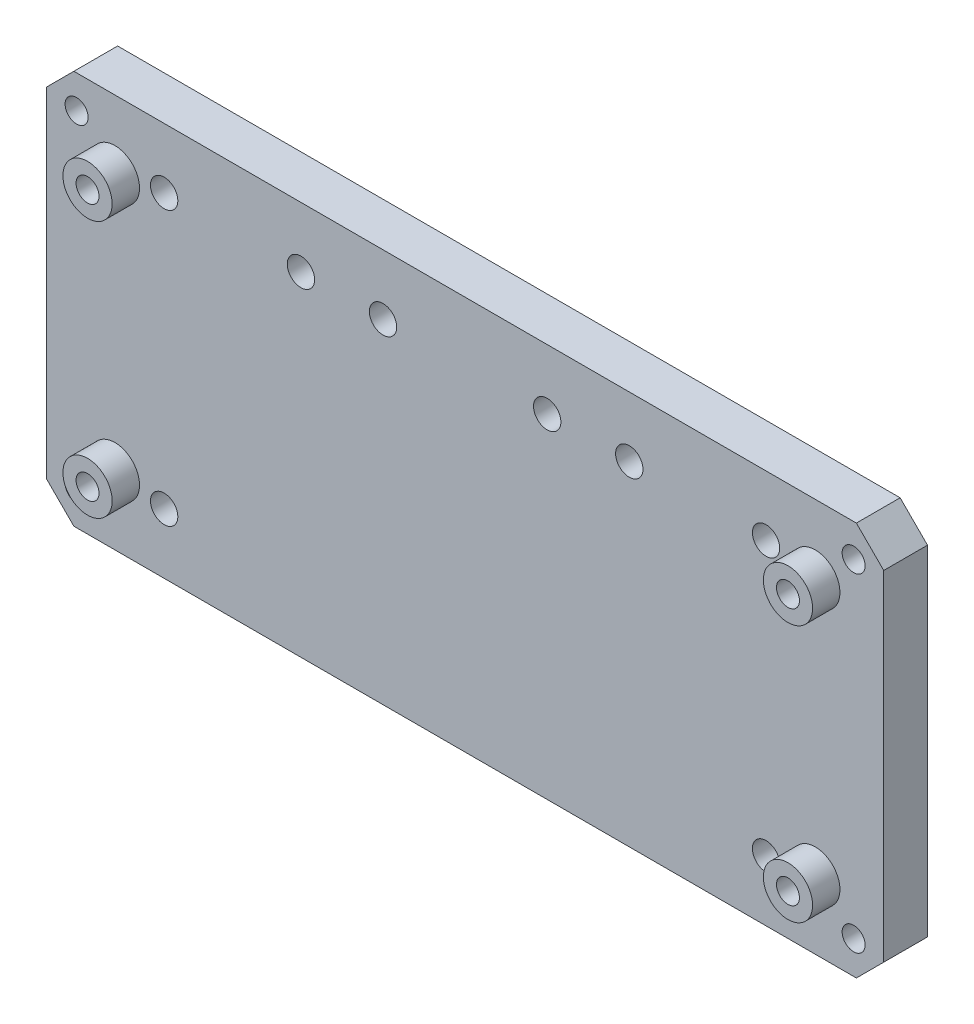
ISO-10303-21;
HEADER;
FILE_DESCRIPTION(('STEP AP214'),'2;1');
FILE_NAME('part.step','',(''),(''),'','','');
FILE_SCHEMA(('AUTOMOTIVE_DESIGN { 1 0 10303 214 1 1 1 1 }'));
ENDSEC;
DATA;
#1=APPLICATION_CONTEXT('core data for automotive mechanical design processes');
#2=APPLICATION_PROTOCOL_DEFINITION('international standard','automotive_design',2000,#1);
#3=PRODUCT_CONTEXT('',#1,'mechanical');
#4=PRODUCT('Part','Part','',(#3));
#5=PRODUCT_RELATED_PRODUCT_CATEGORY('part','',(#4));
#6=PRODUCT_DEFINITION_FORMATION('','',#4);
#7=PRODUCT_DEFINITION_CONTEXT('part definition',#1,'design');
#8=PRODUCT_DEFINITION('design','',#6,#7);
#9=PRODUCT_DEFINITION_SHAPE('','',#8);
#10=(LENGTH_UNIT() NAMED_UNIT(*) SI_UNIT(.MILLI.,.METRE.));
#11=(NAMED_UNIT(*) PLANE_ANGLE_UNIT() SI_UNIT($,.RADIAN.));
#12=(NAMED_UNIT(*) SI_UNIT($,.STERADIAN.) SOLID_ANGLE_UNIT());
#13=UNCERTAINTY_MEASURE_WITH_UNIT(LENGTH_MEASURE(1.E-05),#10,'distance_accuracy_value','');
#14=(GEOMETRIC_REPRESENTATION_CONTEXT(3) GLOBAL_UNCERTAINTY_ASSIGNED_CONTEXT((#13)) GLOBAL_UNIT_ASSIGNED_CONTEXT((#10,
#11,#12)) REPRESENTATION_CONTEXT('',''));
#15=CARTESIAN_POINT('',(0.,0.,0.));
#16=DIRECTION('',(0.,0.,1.));
#17=DIRECTION('',(1.,0.,0.));
#18=AXIS2_PLACEMENT_3D('',#15,#16,#17);
#19=CARTESIAN_POINT('',(0.,0.,8.));
#20=DIRECTION('',(0.,0.,-1.));
#21=DIRECTION('',(-1.,0.,0.));
#22=AXIS2_PLACEMENT_3D('',#19,#20,#21);
#23=PLANE('',#22);
#24=CARTESIAN_POINT('',(5.49999999999999,66.,8.));
#25=DIRECTION('',(0.,0.,1.));
#26=DIRECTION('',(-1.,0.,0.));
#27=AXIS2_PLACEMENT_3D('',#24,#25,#26);
#28=CIRCLE('',#27,2.1);
#29=CARTESIAN_POINT('',(3.39999999999999,66.,8.));
#30=VERTEX_POINT('',#29);
#31=EDGE_CURVE('E287',#30,#30,#28,.T.);
#32=ORIENTED_EDGE('',*,*,#31,.F.);
#33=EDGE_LOOP('',(#32));
#34=FACE_BOUND('',#33,.T.);
#35=CARTESIAN_POINT('',(147.5,6.00000000000003,8.));
#36=DIRECTION('',(0.,0.,1.));
#37=DIRECTION('',(-1.,0.,0.));
#38=AXIS2_PLACEMENT_3D('',#35,#36,#37);
#39=CIRCLE('',#38,2.10000000000002);
#40=CARTESIAN_POINT('',(145.4,6.00000000000003,8.));
#41=VERTEX_POINT('',#40);
#42=EDGE_CURVE('E280',#41,#41,#39,.T.);
#43=ORIENTED_EDGE('',*,*,#42,.F.);
#44=EDGE_LOOP('',(#43));
#45=FACE_BOUND('',#44,.T.);
#46=CARTESIAN_POINT('',(147.5,66.,8.));
#47=DIRECTION('',(0.,0.,1.));
#48=DIRECTION('',(1.,0.,0.));
#49=AXIS2_PLACEMENT_3D('',#46,#47,#48);
#50=CIRCLE('',#49,2.10000000000002);
#51=CARTESIAN_POINT('',(149.6,66.,8.));
#52=VERTEX_POINT('',#51);
#53=EDGE_CURVE('E292',#52,#52,#50,.T.);
#54=ORIENTED_EDGE('',*,*,#53,.F.);
#55=EDGE_LOOP('',(#54));
#56=FACE_BOUND('',#55,.T.);
#57=CARTESIAN_POINT('',(5.49999999999999,6.,8.));
#58=DIRECTION('',(0.,0.,1.));
#59=DIRECTION('',(1.,0.,0.));
#60=AXIS2_PLACEMENT_3D('',#57,#58,#59);
#61=CIRCLE('',#60,2.1);
#62=CARTESIAN_POINT('',(7.6,6.,8.));
#63=VERTEX_POINT('',#62);
#64=EDGE_CURVE('E274',#63,#63,#61,.T.);
#65=ORIENTED_EDGE('',*,*,#64,.F.);
#66=EDGE_LOOP('',(#65));
#67=FACE_BOUND('',#66,.T.);
#68=CARTESIAN_POINT('',(140.5,12.5,8.));
#69=DIRECTION('',(0.,0.,-1.));
#70=DIRECTION('',(-1.,0.,0.));
#71=AXIS2_PLACEMENT_3D('',#68,#69,#70);
#72=CIRCLE('',#71,4.50000000000002);
#73=CARTESIAN_POINT('',(136.,12.5,8.));
#74=VERTEX_POINT('',#73);
#75=EDGE_CURVE('E149',#74,#74,#72,.F.);
#76=ORIENTED_EDGE('',*,*,#75,.F.);
#77=EDGE_LOOP('',(#76));
#78=FACE_BOUND('',#77,.T.);
#79=CARTESIAN_POINT('',(140.5,59.5,8.));
#80=DIRECTION('',(0.,0.,-1.));
#81=DIRECTION('',(-1.,0.,0.));
#82=AXIS2_PLACEMENT_3D('',#79,#80,#81);
#83=CIRCLE('',#82,4.50000000000002);
#84=CARTESIAN_POINT('',(136.,59.5,8.));
#85=VERTEX_POINT('',#84);
#86=EDGE_CURVE('E146',#85,#85,#83,.F.);
#87=ORIENTED_EDGE('',*,*,#86,.F.);
#88=EDGE_LOOP('',(#87));
#89=FACE_BOUND('',#88,.T.);
#90=CARTESIAN_POINT('',(12.5,12.5,8.));
#91=DIRECTION('',(0.,0.,-1.));
#92=DIRECTION('',(-1.,0.,0.));
#93=AXIS2_PLACEMENT_3D('',#90,#91,#92);
#94=CIRCLE('',#93,4.50000000000001);
#95=CARTESIAN_POINT('',(7.99999999999999,12.5,8.));
#96=VERTEX_POINT('',#95);
#97=EDGE_CURVE('E143',#96,#96,#94,.F.);
#98=ORIENTED_EDGE('',*,*,#97,.F.);
#99=EDGE_LOOP('',(#98));
#100=FACE_BOUND('',#99,.T.);
#101=CARTESIAN_POINT('',(12.5,59.5,8.));
#102=DIRECTION('',(0.,0.,-1.));
#103=DIRECTION('',(-1.,0.,0.));
#104=AXIS2_PLACEMENT_3D('',#101,#102,#103);
#105=CIRCLE('',#104,4.50000000000001);
#106=CARTESIAN_POINT('',(7.99999999999999,59.5,8.));
#107=VERTEX_POINT('',#106);
#108=EDGE_CURVE('E140',#107,#107,#105,.F.);
#109=ORIENTED_EDGE('',*,*,#108,.F.);
#110=EDGE_LOOP('',(#109));
#111=FACE_BOUND('',#110,.T.);
#112=DIRECTION('',(0.,1.,0.));
#113=VECTOR('',#112,1.);
#114=CARTESIAN_POINT('',(153.,0.,8.));
#115=LINE('',#114,#113);
#116=CARTESIAN_POINT('',(153.,4.99999999999996,8.));
#117=VERTEX_POINT('',#116);
#118=CARTESIAN_POINT('',(153.,66.9999999999999,8.));
#119=VERTEX_POINT('',#118);
#120=EDGE_CURVE('E187',#117,#119,#115,.T.);
#121=ORIENTED_EDGE('',*,*,#120,.T.);
#122=DIRECTION('',(0.707106781186546,-0.707106781186549,0.));
#123=VECTOR('',#122,1.);
#124=CARTESIAN_POINT('',(148.,72.,8.));
#125=LINE('',#124,#123);
#126=CARTESIAN_POINT('',(148.,72.,8.));
#127=VERTEX_POINT('',#126);
#128=EDGE_CURVE('E164',#119,#127,#125,.F.);
#129=ORIENTED_EDGE('',*,*,#128,.T.);
#130=DIRECTION('',(-1.,0.,0.));
#131=VECTOR('',#130,1.);
#132=CARTESIAN_POINT('',(0.,72.,8.));
#133=LINE('',#132,#131);
#134=CARTESIAN_POINT('',(5.,72.,8.));
#135=VERTEX_POINT('',#134);
#136=EDGE_CURVE('E123',#127,#135,#133,.T.);
#137=ORIENTED_EDGE('',*,*,#136,.T.);
#138=DIRECTION('',(0.707106781186549,0.707106781186547,0.));
#139=VECTOR('',#138,1.);
#140=CARTESIAN_POINT('',(0.,67.,8.));
#141=LINE('',#140,#139);
#142=CARTESIAN_POINT('',(0.,67.,8.));
#143=VERTEX_POINT('',#142);
#144=EDGE_CURVE('E160',#135,#143,#141,.F.);
#145=ORIENTED_EDGE('',*,*,#144,.T.);
#146=DIRECTION('',(0.,-1.,0.));
#147=VECTOR('',#146,1.);
#148=CARTESIAN_POINT('',(0.,0.,8.));
#149=LINE('',#148,#147);
#150=CARTESIAN_POINT('',(0.,4.99999999999999,8.));
#151=VERTEX_POINT('',#150);
#152=EDGE_CURVE('E131',#143,#151,#149,.T.);
#153=ORIENTED_EDGE('',*,*,#152,.T.);
#154=DIRECTION('',(-0.707106781186546,0.707106781186549,0.));
#155=VECTOR('',#154,1.);
#156=CARTESIAN_POINT('',(4.99999999999996,0.,8.));
#157=LINE('',#156,#155);
#158=CARTESIAN_POINT('',(4.99999999999996,0.,8.));
#159=VERTEX_POINT('',#158);
#160=EDGE_CURVE('E58',#151,#159,#157,.F.);
#161=ORIENTED_EDGE('',*,*,#160,.T.);
#162=DIRECTION('',(1.,0.,0.));
#163=VECTOR('',#162,1.);
#164=CARTESIAN_POINT('',(0.,0.,8.));
#165=LINE('',#164,#163);
#166=CARTESIAN_POINT('',(148.,0.,8.));
#167=VERTEX_POINT('',#166);
#168=EDGE_CURVE('E134',#159,#167,#165,.T.);
#169=ORIENTED_EDGE('',*,*,#168,.T.);
#170=DIRECTION('',(-0.707106781186549,-0.707106781186547,0.));
#171=VECTOR('',#170,1.);
#172=CARTESIAN_POINT('',(153.,4.99999999999996,8.));
#173=LINE('',#172,#171);
#174=EDGE_CURVE('E162',#167,#117,#173,.F.);
#175=ORIENTED_EDGE('',*,*,#174,.T.);
#176=EDGE_LOOP('',(#121,#129,#137,#145,#153,#161,#169,#175));
#177=FACE_BOUND('',#176,.T.);
#178=CARTESIAN_POINT('',(21.5,61.,8.));
#179=DIRECTION('',(0.,0.,1.));
#180=DIRECTION('',(1.,0.,0.));
#181=AXIS2_PLACEMENT_3D('',#178,#179,#180);
#182=CIRCLE('',#181,2.5);
#183=CARTESIAN_POINT('',(24.,61.,8.));
#184=VERTEX_POINT('',#183);
#185=EDGE_CURVE('E183',#184,#184,#182,.T.);
#186=ORIENTED_EDGE('',*,*,#185,.F.);
#187=EDGE_LOOP('',(#186));
#188=FACE_BOUND('',#187,.T.);
#189=CARTESIAN_POINT('',(21.5,11.,8.));
#190=DIRECTION('',(0.,0.,1.));
#191=DIRECTION('',(-1.,0.,0.));
#192=AXIS2_PLACEMENT_3D('',#189,#190,#191);
#193=CIRCLE('',#192,2.5);
#194=CARTESIAN_POINT('',(19.,11.,8.));
#195=VERTEX_POINT('',#194);
#196=EDGE_CURVE('E193',#195,#195,#193,.T.);
#197=ORIENTED_EDGE('',*,*,#196,.F.);
#198=EDGE_LOOP('',(#197));
#199=FACE_BOUND('',#198,.T.);
#200=CARTESIAN_POINT('',(131.5,61.,8.));
#201=DIRECTION('',(0.,0.,1.));
#202=DIRECTION('',(-1.,0.,0.));
#203=AXIS2_PLACEMENT_3D('',#200,#201,#202);
#204=CIRCLE('',#203,2.5);
#205=CARTESIAN_POINT('',(129.,61.,8.));
#206=VERTEX_POINT('',#205);
#207=EDGE_CURVE('E199',#206,#206,#204,.T.);
#208=ORIENTED_EDGE('',*,*,#207,.F.);
#209=EDGE_LOOP('',(#208));
#210=FACE_BOUND('',#209,.T.);
#211=CARTESIAN_POINT('',(131.5,11.,8.));
#212=DIRECTION('',(0.,0.,1.));
#213=DIRECTION('',(1.,0.,0.));
#214=AXIS2_PLACEMENT_3D('',#211,#212,#213);
#215=CIRCLE('',#214,2.5);
#216=CARTESIAN_POINT('',(134.,11.,8.));
#217=VERTEX_POINT('',#216);
#218=EDGE_CURVE('E205',#217,#217,#215,.T.);
#219=ORIENTED_EDGE('',*,*,#218,.F.);
#220=EDGE_LOOP('',(#219));
#221=FACE_BOUND('',#220,.T.);
#222=CARTESIAN_POINT('',(61.5,61.,8.));
#223=DIRECTION('',(0.,0.,1.));
#224=DIRECTION('',(1.,0.,0.));
#225=AXIS2_PLACEMENT_3D('',#222,#223,#224);
#226=CIRCLE('',#225,2.5);
#227=CARTESIAN_POINT('',(64.,61.,8.));
#228=VERTEX_POINT('',#227);
#229=EDGE_CURVE('E211',#228,#228,#226,.T.);
#230=ORIENTED_EDGE('',*,*,#229,.F.);
#231=EDGE_LOOP('',(#230));
#232=FACE_BOUND('',#231,.T.);
#233=CARTESIAN_POINT('',(46.5,61.,8.));
#234=DIRECTION('',(0.,0.,1.));
#235=DIRECTION('',(1.,0.,0.));
#236=AXIS2_PLACEMENT_3D('',#233,#234,#235);
#237=CIRCLE('',#236,2.5);
#238=CARTESIAN_POINT('',(49.,61.,8.));
#239=VERTEX_POINT('',#238);
#240=EDGE_CURVE('E217',#239,#239,#237,.T.);
#241=ORIENTED_EDGE('',*,*,#240,.F.);
#242=EDGE_LOOP('',(#241));
#243=FACE_BOUND('',#242,.T.);
#244=CARTESIAN_POINT('',(106.5,61.,8.));
#245=DIRECTION('',(0.,0.,1.));
#246=DIRECTION('',(-1.,0.,0.));
#247=AXIS2_PLACEMENT_3D('',#244,#245,#246);
#248=CIRCLE('',#247,2.50000000000001);
#249=CARTESIAN_POINT('',(104.,61.,8.));
#250=VERTEX_POINT('',#249);
#251=EDGE_CURVE('E223',#250,#250,#248,.T.);
#252=ORIENTED_EDGE('',*,*,#251,.F.);
#253=EDGE_LOOP('',(#252));
#254=FACE_BOUND('',#253,.T.);
#255=CARTESIAN_POINT('',(91.5,61.,8.));
#256=DIRECTION('',(0.,0.,1.));
#257=DIRECTION('',(-1.,0.,0.));
#258=AXIS2_PLACEMENT_3D('',#255,#256,#257);
#259=CIRCLE('',#258,2.5);
#260=CARTESIAN_POINT('',(89.,61.,8.));
#261=VERTEX_POINT('',#260);
#262=EDGE_CURVE('E229',#261,#261,#259,.T.);
#263=ORIENTED_EDGE('',*,*,#262,.F.);
#264=EDGE_LOOP('',(#263));
#265=FACE_BOUND('',#264,.T.);
#266=ADVANCED_FACE('F35',(#34,#45,#56,#67,#78,#89,#100,#111,#177,#188,#199,#210,#221,#232,#243,
#254,#265),#23,.F.);
#267=CARTESIAN_POINT('',(0.,0.,0.));
#268=DIRECTION('',(0.,0.,-1.));
#269=DIRECTION('',(-1.,0.,0.));
#270=AXIS2_PLACEMENT_3D('',#267,#268,#269);
#271=PLANE('',#270);
#272=CARTESIAN_POINT('',(106.5,61.,0.));
#273=DIRECTION('',(0.,0.,1.));
#274=DIRECTION('',(-1.,0.,0.));
#275=AXIS2_PLACEMENT_3D('',#272,#273,#274);
#276=CIRCLE('',#275,2.50000000000001);
#277=CARTESIAN_POINT('',(104.,61.,0.));
#278=VERTEX_POINT('',#277);
#279=EDGE_CURVE('E226',#278,#278,#276,.T.);
#280=ORIENTED_EDGE('',*,*,#279,.T.);
#281=EDGE_LOOP('',(#280));
#282=FACE_BOUND('',#281,.T.);
#283=CARTESIAN_POINT('',(61.5,61.,0.));
#284=DIRECTION('',(0.,0.,1.));
#285=DIRECTION('',(1.,0.,0.));
#286=AXIS2_PLACEMENT_3D('',#283,#284,#285);
#287=CIRCLE('',#286,2.5);
#288=CARTESIAN_POINT('',(64.,61.,0.));
#289=VERTEX_POINT('',#288);
#290=EDGE_CURVE('E214',#289,#289,#287,.T.);
#291=ORIENTED_EDGE('',*,*,#290,.T.);
#292=EDGE_LOOP('',(#291));
#293=FACE_BOUND('',#292,.T.);
#294=CARTESIAN_POINT('',(131.5,61.,0.));
#295=DIRECTION('',(0.,0.,1.));
#296=DIRECTION('',(-1.,0.,0.));
#297=AXIS2_PLACEMENT_3D('',#294,#295,#296);
#298=CIRCLE('',#297,2.5);
#299=CARTESIAN_POINT('',(129.,61.,0.));
#300=VERTEX_POINT('',#299);
#301=EDGE_CURVE('E202',#300,#300,#298,.T.);
#302=ORIENTED_EDGE('',*,*,#301,.T.);
#303=EDGE_LOOP('',(#302));
#304=FACE_BOUND('',#303,.T.);
#305=CARTESIAN_POINT('',(21.5,61.,0.));
#306=DIRECTION('',(0.,0.,1.));
#307=DIRECTION('',(1.,0.,0.));
#308=AXIS2_PLACEMENT_3D('',#305,#306,#307);
#309=CIRCLE('',#308,2.5);
#310=CARTESIAN_POINT('',(24.,61.,0.));
#311=VERTEX_POINT('',#310);
#312=EDGE_CURVE('E190',#311,#311,#309,.T.);
#313=ORIENTED_EDGE('',*,*,#312,.T.);
#314=EDGE_LOOP('',(#313));
#315=FACE_BOUND('',#314,.T.);
#316=DIRECTION('',(-1.,0.,0.));
#317=VECTOR('',#316,1.);
#318=CARTESIAN_POINT('',(0.,72.,0.));
#319=LINE('',#318,#317);
#320=CARTESIAN_POINT('',(148.,72.,0.));
#321=VERTEX_POINT('',#320);
#322=CARTESIAN_POINT('',(5.,72.,0.));
#323=VERTEX_POINT('',#322);
#324=EDGE_CURVE('E120',#321,#323,#319,.T.);
#325=ORIENTED_EDGE('',*,*,#324,.F.);
#326=DIRECTION('',(-0.707106781186546,0.707106781186549,0.));
#327=VECTOR('',#326,1.);
#328=CARTESIAN_POINT('',(110.,110.,0.));
#329=LINE('',#328,#327);
#330=CARTESIAN_POINT('',(153.,66.9999999999999,0.));
#331=VERTEX_POINT('',#330);
#332=EDGE_CURVE('E103',#321,#331,#329,.F.);
#333=ORIENTED_EDGE('',*,*,#332,.T.);
#334=DIRECTION('',(0.,1.,0.));
#335=VECTOR('',#334,1.);
#336=CARTESIAN_POINT('',(153.,0.,0.));
#337=LINE('',#336,#335);
#338=CARTESIAN_POINT('',(153.,4.99999999999996,0.));
#339=VERTEX_POINT('',#338);
#340=EDGE_CURVE('E132',#339,#331,#337,.T.);
#341=ORIENTED_EDGE('',*,*,#340,.F.);
#342=DIRECTION('',(0.707106781186549,0.707106781186547,0.));
#343=VECTOR('',#342,1.);
#344=CARTESIAN_POINT('',(73.9999999999998,-74.,0.));
#345=LINE('',#344,#343);
#346=CARTESIAN_POINT('',(148.,0.,0.));
#347=VERTEX_POINT('',#346);
#348=EDGE_CURVE('E114',#339,#347,#345,.F.);
#349=ORIENTED_EDGE('',*,*,#348,.T.);
#350=DIRECTION('',(1.,0.,0.));
#351=VECTOR('',#350,1.);
#352=CARTESIAN_POINT('',(0.,0.,0.));
#353=LINE('',#352,#351);
#354=CARTESIAN_POINT('',(4.99999999999996,0.,0.));
#355=VERTEX_POINT('',#354);
#356=EDGE_CURVE('E136',#355,#347,#353,.T.);
#357=ORIENTED_EDGE('',*,*,#356,.F.);
#358=DIRECTION('',(0.707106781186546,-0.707106781186549,0.));
#359=VECTOR('',#358,1.);
#360=CARTESIAN_POINT('',(2.5,2.49999999999998,0.));
#361=LINE('',#360,#359);
#362=CARTESIAN_POINT('',(0.,4.99999999999999,0.));
#363=VERTEX_POINT('',#362);
#364=EDGE_CURVE('E124',#355,#363,#361,.F.);
#365=ORIENTED_EDGE('',*,*,#364,.T.);
#366=DIRECTION('',(0.,-1.,0.));
#367=VECTOR('',#366,1.);
#368=CARTESIAN_POINT('',(0.,0.,0.));
#369=LINE('',#368,#367);
#370=CARTESIAN_POINT('',(0.,67.,0.));
#371=VERTEX_POINT('',#370);
#372=EDGE_CURVE('E175',#371,#363,#369,.T.);
#373=ORIENTED_EDGE('',*,*,#372,.F.);
#374=DIRECTION('',(-0.707106781186549,-0.707106781186547,0.));
#375=VECTOR('',#374,1.);
#376=CARTESIAN_POINT('',(-33.5,33.5000000000001,0.));
#377=LINE('',#376,#375);
#378=EDGE_CURVE('E130',#371,#323,#377,.F.);
#379=ORIENTED_EDGE('',*,*,#378,.T.);
#380=EDGE_LOOP('',(#325,#333,#341,#349,#357,#365,#373,#379));
#381=FACE_BOUND('',#380,.T.);
#382=CARTESIAN_POINT('',(21.5,11.,0.));
#383=DIRECTION('',(0.,0.,1.));
#384=DIRECTION('',(-1.,0.,0.));
#385=AXIS2_PLACEMENT_3D('',#382,#383,#384);
#386=CIRCLE('',#385,2.5);
#387=CARTESIAN_POINT('',(19.,11.,0.));
#388=VERTEX_POINT('',#387);
#389=EDGE_CURVE('E196',#388,#388,#386,.T.);
#390=ORIENTED_EDGE('',*,*,#389,.T.);
#391=EDGE_LOOP('',(#390));
#392=FACE_BOUND('',#391,.T.);
#393=CARTESIAN_POINT('',(131.5,11.,0.));
#394=DIRECTION('',(0.,0.,1.));
#395=DIRECTION('',(1.,0.,0.));
#396=AXIS2_PLACEMENT_3D('',#393,#394,#395);
#397=CIRCLE('',#396,2.5);
#398=CARTESIAN_POINT('',(134.,11.,0.));
#399=VERTEX_POINT('',#398);
#400=EDGE_CURVE('E208',#399,#399,#397,.T.);
#401=ORIENTED_EDGE('',*,*,#400,.T.);
#402=EDGE_LOOP('',(#401));
#403=FACE_BOUND('',#402,.T.);
#404=CARTESIAN_POINT('',(46.5,61.,0.));
#405=DIRECTION('',(0.,0.,1.));
#406=DIRECTION('',(1.,0.,0.));
#407=AXIS2_PLACEMENT_3D('',#404,#405,#406);
#408=CIRCLE('',#407,2.5);
#409=CARTESIAN_POINT('',(49.,61.,0.));
#410=VERTEX_POINT('',#409);
#411=EDGE_CURVE('E220',#410,#410,#408,.T.);
#412=ORIENTED_EDGE('',*,*,#411,.T.);
#413=EDGE_LOOP('',(#412));
#414=FACE_BOUND('',#413,.T.);
#415=CARTESIAN_POINT('',(91.5,61.,0.));
#416=DIRECTION('',(0.,0.,1.));
#417=DIRECTION('',(-1.,0.,0.));
#418=AXIS2_PLACEMENT_3D('',#415,#416,#417);
#419=CIRCLE('',#418,2.5);
#420=CARTESIAN_POINT('',(89.,61.,0.));
#421=VERTEX_POINT('',#420);
#422=EDGE_CURVE('E232',#421,#421,#419,.T.);
#423=ORIENTED_EDGE('',*,*,#422,.T.);
#424=EDGE_LOOP('',(#423));
#425=FACE_BOUND('',#424,.T.);
#426=ADVANCED_FACE('F127',(#282,#293,#304,#315,#381,#392,#403,#414,#425),#271,.T.);
#427=CARTESIAN_POINT('',(0.,0.,8.));
#428=DIRECTION('',(1.,0.,0.));
#429=DIRECTION('',(0.,0.,-1.));
#430=AXIS2_PLACEMENT_3D('',#427,#428,#429);
#431=PLANE('',#430);
#432=ORIENTED_EDGE('',*,*,#152,.F.);
#433=DIRECTION('',(0.,0.,-1.));
#434=VECTOR('',#433,1.);
#435=CARTESIAN_POINT('',(0.,67.,8.));
#436=LINE('',#435,#434);
#437=EDGE_CURVE('E11',#143,#371,#436,.T.);
#438=ORIENTED_EDGE('',*,*,#437,.T.);
#439=ORIENTED_EDGE('',*,*,#372,.T.);
#440=DIRECTION('',(0.,0.,1.));
#441=VECTOR('',#440,1.);
#442=CARTESIAN_POINT('',(0.,4.99999999999999,8.));
#443=LINE('',#442,#441);
#444=EDGE_CURVE('E44',#363,#151,#443,.T.);
#445=ORIENTED_EDGE('',*,*,#444,.T.);
#446=EDGE_LOOP('',(#432,#438,#439,#445));
#447=FACE_BOUND('',#446,.T.);
#448=ADVANCED_FACE('F173',(#447),#431,.F.);
#449=CARTESIAN_POINT('',(0.,0.,8.));
#450=DIRECTION('',(0.,1.,0.));
#451=DIRECTION('',(0.,0.,1.));
#452=AXIS2_PLACEMENT_3D('',#449,#450,#451);
#453=PLANE('',#452);
#454=ORIENTED_EDGE('',*,*,#356,.T.);
#455=DIRECTION('',(0.,0.,1.));
#456=VECTOR('',#455,1.);
#457=CARTESIAN_POINT('',(148.,0.,8.));
#458=LINE('',#457,#456);
#459=EDGE_CURVE('E51',#347,#167,#458,.T.);
#460=ORIENTED_EDGE('',*,*,#459,.T.);
#461=ORIENTED_EDGE('',*,*,#168,.F.);
#462=DIRECTION('',(0.,0.,-1.));
#463=VECTOR('',#462,1.);
#464=CARTESIAN_POINT('',(4.99999999999996,0.,8.));
#465=LINE('',#464,#463);
#466=EDGE_CURVE('E166',#159,#355,#465,.T.);
#467=ORIENTED_EDGE('',*,*,#466,.T.);
#468=EDGE_LOOP('',(#454,#460,#461,#467));
#469=FACE_BOUND('',#468,.T.);
#470=ADVANCED_FACE('F182',(#469),#453,.F.);
#471=CARTESIAN_POINT('',(153.,0.,8.));
#472=DIRECTION('',(-1.,0.,0.));
#473=DIRECTION('',(0.,0.,1.));
#474=AXIS2_PLACEMENT_3D('',#471,#472,#473);
#475=PLANE('',#474);
#476=ORIENTED_EDGE('',*,*,#340,.T.);
#477=DIRECTION('',(0.,0.,1.));
#478=VECTOR('',#477,1.);
#479=CARTESIAN_POINT('',(153.,66.9999999999999,8.));
#480=LINE('',#479,#478);
#481=EDGE_CURVE('E108',#331,#119,#480,.T.);
#482=ORIENTED_EDGE('',*,*,#481,.T.);
#483=ORIENTED_EDGE('',*,*,#120,.F.);
#484=DIRECTION('',(0.,0.,-1.));
#485=VECTOR('',#484,1.);
#486=CARTESIAN_POINT('',(153.,4.99999999999996,8.));
#487=LINE('',#486,#485);
#488=EDGE_CURVE('E113',#117,#339,#487,.T.);
#489=ORIENTED_EDGE('',*,*,#488,.T.);
#490=EDGE_LOOP('',(#476,#482,#483,#489));
#491=FACE_BOUND('',#490,.T.);
#492=ADVANCED_FACE('F376',(#491),#475,.F.);
#493=CARTESIAN_POINT('',(0.,72.,8.));
#494=DIRECTION('',(0.,-1.,0.));
#495=DIRECTION('',(0.,0.,-1.));
#496=AXIS2_PLACEMENT_3D('',#493,#494,#495);
#497=PLANE('',#496);
#498=ORIENTED_EDGE('',*,*,#136,.F.);
#499=DIRECTION('',(0.,0.,-1.));
#500=VECTOR('',#499,1.);
#501=CARTESIAN_POINT('',(148.,72.,8.));
#502=LINE('',#501,#500);
#503=EDGE_CURVE('E107',#127,#321,#502,.T.);
#504=ORIENTED_EDGE('',*,*,#503,.T.);
#505=ORIENTED_EDGE('',*,*,#324,.T.);
#506=DIRECTION('',(0.,0.,1.));
#507=VECTOR('',#506,1.);
#508=CARTESIAN_POINT('',(5.,72.,8.));
#509=LINE('',#508,#507);
#510=EDGE_CURVE('E125',#323,#135,#509,.T.);
#511=ORIENTED_EDGE('',*,*,#510,.T.);
#512=EDGE_LOOP('',(#498,#504,#505,#511));
#513=FACE_BOUND('',#512,.T.);
#514=ADVANCED_FACE('F119',(#513),#497,.F.);
#515=CARTESIAN_POINT('',(21.5,61.,8.));
#516=DIRECTION('',(0.,0.,-1.));
#517=DIRECTION('',(-1.,0.,0.));
#518=AXIS2_PLACEMENT_3D('',#515,#516,#517);
#519=CYLINDRICAL_SURFACE('',#518,2.5);
#520=ORIENTED_EDGE('',*,*,#185,.T.);
#521=EDGE_LOOP('',(#520));
#522=FACE_BOUND('',#521,.T.);
#523=ORIENTED_EDGE('',*,*,#312,.F.);
#524=EDGE_LOOP('',(#523));
#525=FACE_BOUND('',#524,.T.);
#526=ADVANCED_FACE('F366',(#522,#525),#519,.F.);
#527=CARTESIAN_POINT('',(21.5,11.,8.));
#528=DIRECTION('',(0.,0.,-1.));
#529=DIRECTION('',(-1.,0.,0.));
#530=AXIS2_PLACEMENT_3D('',#527,#528,#529);
#531=CYLINDRICAL_SURFACE('',#530,2.5);
#532=ORIENTED_EDGE('',*,*,#196,.T.);
#533=EDGE_LOOP('',(#532));
#534=FACE_BOUND('',#533,.T.);
#535=ORIENTED_EDGE('',*,*,#389,.F.);
#536=EDGE_LOOP('',(#535));
#537=FACE_BOUND('',#536,.T.);
#538=ADVANCED_FACE('F362',(#534,#537),#531,.F.);
#539=CARTESIAN_POINT('',(131.5,61.,8.));
#540=DIRECTION('',(0.,0.,-1.));
#541=DIRECTION('',(-1.,0.,0.));
#542=AXIS2_PLACEMENT_3D('',#539,#540,#541);
#543=CYLINDRICAL_SURFACE('',#542,2.5);
#544=ORIENTED_EDGE('',*,*,#207,.T.);
#545=EDGE_LOOP('',(#544));
#546=FACE_BOUND('',#545,.T.);
#547=ORIENTED_EDGE('',*,*,#301,.F.);
#548=EDGE_LOOP('',(#547));
#549=FACE_BOUND('',#548,.T.);
#550=ADVANCED_FACE('F358',(#546,#549),#543,.F.);
#551=CARTESIAN_POINT('',(131.5,11.,8.));
#552=DIRECTION('',(0.,0.,-1.));
#553=DIRECTION('',(-1.,0.,0.));
#554=AXIS2_PLACEMENT_3D('',#551,#552,#553);
#555=CYLINDRICAL_SURFACE('',#554,2.5);
#556=ORIENTED_EDGE('',*,*,#218,.T.);
#557=EDGE_LOOP('',(#556));
#558=FACE_BOUND('',#557,.T.);
#559=ORIENTED_EDGE('',*,*,#400,.F.);
#560=EDGE_LOOP('',(#559));
#561=FACE_BOUND('',#560,.T.);
#562=ADVANCED_FACE('F354',(#558,#561),#555,.F.);
#563=CARTESIAN_POINT('',(61.5,61.,8.));
#564=DIRECTION('',(0.,0.,-1.));
#565=DIRECTION('',(-1.,0.,0.));
#566=AXIS2_PLACEMENT_3D('',#563,#564,#565);
#567=CYLINDRICAL_SURFACE('',#566,2.5);
#568=ORIENTED_EDGE('',*,*,#229,.T.);
#569=EDGE_LOOP('',(#568));
#570=FACE_BOUND('',#569,.T.);
#571=ORIENTED_EDGE('',*,*,#290,.F.);
#572=EDGE_LOOP('',(#571));
#573=FACE_BOUND('',#572,.T.);
#574=ADVANCED_FACE('F350',(#570,#573),#567,.F.);
#575=CARTESIAN_POINT('',(46.5,61.,8.));
#576=DIRECTION('',(0.,0.,-1.));
#577=DIRECTION('',(-1.,0.,0.));
#578=AXIS2_PLACEMENT_3D('',#575,#576,#577);
#579=CYLINDRICAL_SURFACE('',#578,2.5);
#580=ORIENTED_EDGE('',*,*,#240,.T.);
#581=EDGE_LOOP('',(#580));
#582=FACE_BOUND('',#581,.T.);
#583=ORIENTED_EDGE('',*,*,#411,.F.);
#584=EDGE_LOOP('',(#583));
#585=FACE_BOUND('',#584,.T.);
#586=ADVANCED_FACE('F346',(#582,#585),#579,.F.);
#587=CARTESIAN_POINT('',(106.5,61.,8.));
#588=DIRECTION('',(0.,0.,-1.));
#589=DIRECTION('',(-1.,0.,0.));
#590=AXIS2_PLACEMENT_3D('',#587,#588,#589);
#591=CYLINDRICAL_SURFACE('',#590,2.50000000000001);
#592=ORIENTED_EDGE('',*,*,#251,.T.);
#593=EDGE_LOOP('',(#592));
#594=FACE_BOUND('',#593,.T.);
#595=ORIENTED_EDGE('',*,*,#279,.F.);
#596=EDGE_LOOP('',(#595));
#597=FACE_BOUND('',#596,.T.);
#598=ADVANCED_FACE('F342',(#594,#597),#591,.F.);
#599=CARTESIAN_POINT('',(91.5,61.,8.));
#600=DIRECTION('',(0.,0.,-1.));
#601=DIRECTION('',(-1.,0.,0.));
#602=AXIS2_PLACEMENT_3D('',#599,#600,#601);
#603=CYLINDRICAL_SURFACE('',#602,2.5);
#604=ORIENTED_EDGE('',*,*,#262,.T.);
#605=EDGE_LOOP('',(#604));
#606=FACE_BOUND('',#605,.T.);
#607=ORIENTED_EDGE('',*,*,#422,.F.);
#608=EDGE_LOOP('',(#607));
#609=FACE_BOUND('',#608,.T.);
#610=ADVANCED_FACE('F335',(#606,#609),#603,.F.);
#611=CARTESIAN_POINT('',(12.5,59.5,13.));
#612=DIRECTION('',(0.,0.,1.));
#613=DIRECTION('',(1.,0.,0.));
#614=AXIS2_PLACEMENT_3D('',#611,#612,#613);
#615=PLANE('',#614);
#616=CARTESIAN_POINT('',(12.5,59.5,13.));
#617=DIRECTION('',(0.,0.,1.));
#618=DIRECTION('',(1.,0.,0.));
#619=AXIS2_PLACEMENT_3D('',#616,#617,#618);
#620=CIRCLE('',#619,4.50000000000001);
#621=CARTESIAN_POINT('',(17.,59.5,13.));
#622=VERTEX_POINT('',#621);
#623=EDGE_CURVE('E235',#622,#622,#620,.T.);
#624=ORIENTED_EDGE('',*,*,#623,.T.);
#625=EDGE_LOOP('',(#624));
#626=FACE_BOUND('',#625,.T.);
#627=CARTESIAN_POINT('',(12.5,59.5,13.));
#628=DIRECTION('',(0.,0.,1.));
#629=DIRECTION('',(1.,0.,0.));
#630=AXIS2_PLACEMENT_3D('',#627,#628,#629);
#631=CIRCLE('',#630,2.1);
#632=CARTESIAN_POINT('',(14.6,59.5,13.));
#633=VERTEX_POINT('',#632);
#634=EDGE_CURVE('E240',#633,#633,#631,.T.);
#635=ORIENTED_EDGE('',*,*,#634,.F.);
#636=EDGE_LOOP('',(#635));
#637=FACE_BOUND('',#636,.T.);
#638=ADVANCED_FACE('F326',(#626,#637),#615,.T.);
#639=CARTESIAN_POINT('',(12.5,59.5,13.));
#640=DIRECTION('',(0.,0.,-1.));
#641=DIRECTION('',(-1.,0.,0.));
#642=AXIS2_PLACEMENT_3D('',#639,#640,#641);
#643=CYLINDRICAL_SURFACE('',#642,4.50000000000001);
#644=ORIENTED_EDGE('',*,*,#623,.F.);
#645=EDGE_LOOP('',(#644));
#646=FACE_BOUND('',#645,.T.);
#647=ORIENTED_EDGE('',*,*,#108,.T.);
#648=EDGE_LOOP('',(#647));
#649=FACE_BOUND('',#648,.T.);
#650=ADVANCED_FACE('F323',(#646,#649),#643,.T.);
#651=CARTESIAN_POINT('',(12.5,59.5,13.));
#652=DIRECTION('',(0.,0.,-1.));
#653=DIRECTION('',(-1.,0.,0.));
#654=AXIS2_PLACEMENT_3D('',#651,#652,#653);
#655=CYLINDRICAL_SURFACE('',#654,2.1);
#656=ORIENTED_EDGE('',*,*,#634,.T.);
#657=EDGE_LOOP('',(#656));
#658=FACE_BOUND('',#657,.T.);
#659=CARTESIAN_POINT('',(12.5,59.5,8.));
#660=DIRECTION('',(0.,0.,1.));
#661=DIRECTION('',(1.,0.,0.));
#662=AXIS2_PLACEMENT_3D('',#659,#660,#661);
#663=CIRCLE('',#662,2.1);
#664=CARTESIAN_POINT('',(14.6,59.5,8.));
#665=VERTEX_POINT('',#664);
#666=EDGE_CURVE('E241',#665,#665,#663,.T.);
#667=ORIENTED_EDGE('',*,*,#666,.F.);
#668=EDGE_LOOP('',(#667));
#669=FACE_BOUND('',#668,.T.);
#670=ADVANCED_FACE('F325',(#658,#669),#655,.F.);
#671=ORIENTED_EDGE('',*,*,#666,.T.);
#672=EDGE_LOOP('',(#671));
#673=FACE_BOUND('',#672,.T.);
#674=ADVANCED_FACE('F312',(#673),#23,.F.);
#675=CARTESIAN_POINT('',(12.5,12.5,13.));
#676=DIRECTION('',(0.,0.,-1.));
#677=DIRECTION('',(-1.,0.,0.));
#678=AXIS2_PLACEMENT_3D('',#675,#676,#677);
#679=PLANE('',#678);
#680=CARTESIAN_POINT('',(12.5,12.5,13.));
#681=DIRECTION('',(0.,0.,1.));
#682=DIRECTION('',(-1.,0.,0.));
#683=AXIS2_PLACEMENT_3D('',#680,#681,#682);
#684=CIRCLE('',#683,4.50000000000001);
#685=CARTESIAN_POINT('',(7.99999999999999,12.5,13.));
#686=VERTEX_POINT('',#685);
#687=EDGE_CURVE('E244',#686,#686,#684,.T.);
#688=ORIENTED_EDGE('',*,*,#687,.T.);
#689=EDGE_LOOP('',(#688));
#690=FACE_BOUND('',#689,.T.);
#691=CARTESIAN_POINT('',(12.5,12.5,13.));
#692=DIRECTION('',(0.,0.,1.));
#693=DIRECTION('',(-1.,0.,0.));
#694=AXIS2_PLACEMENT_3D('',#691,#692,#693);
#695=CIRCLE('',#694,2.1);
#696=CARTESIAN_POINT('',(10.4,12.5,13.));
#697=VERTEX_POINT('',#696);
#698=EDGE_CURVE('E249',#697,#697,#695,.T.);
#699=ORIENTED_EDGE('',*,*,#698,.F.);
#700=EDGE_LOOP('',(#699));
#701=FACE_BOUND('',#700,.T.);
#702=ADVANCED_FACE('F453',(#690,#701),#679,.F.);
#703=CARTESIAN_POINT('',(12.5,12.5,13.));
#704=DIRECTION('',(0.,0.,-1.));
#705=DIRECTION('',(-1.,0.,0.));
#706=AXIS2_PLACEMENT_3D('',#703,#704,#705);
#707=CYLINDRICAL_SURFACE('',#706,4.50000000000001);
#708=ORIENTED_EDGE('',*,*,#687,.F.);
#709=EDGE_LOOP('',(#708));
#710=FACE_BOUND('',#709,.T.);
#711=ORIENTED_EDGE('',*,*,#97,.T.);
#712=EDGE_LOOP('',(#711));
#713=FACE_BOUND('',#712,.T.);
#714=ADVANCED_FACE('F451',(#710,#713),#707,.T.);
#715=CARTESIAN_POINT('',(12.5,12.5,13.));
#716=DIRECTION('',(0.,0.,-1.));
#717=DIRECTION('',(-1.,0.,0.));
#718=AXIS2_PLACEMENT_3D('',#715,#716,#717);
#719=CYLINDRICAL_SURFACE('',#718,2.1);
#720=ORIENTED_EDGE('',*,*,#698,.T.);
#721=EDGE_LOOP('',(#720));
#722=FACE_BOUND('',#721,.T.);
#723=CARTESIAN_POINT('',(12.5,12.5,8.));
#724=DIRECTION('',(0.,0.,1.));
#725=DIRECTION('',(-1.,0.,0.));
#726=AXIS2_PLACEMENT_3D('',#723,#724,#725);
#727=CIRCLE('',#726,2.1);
#728=CARTESIAN_POINT('',(10.4,12.5,8.));
#729=VERTEX_POINT('',#728);
#730=EDGE_CURVE('E250',#729,#729,#727,.T.);
#731=ORIENTED_EDGE('',*,*,#730,.F.);
#732=EDGE_LOOP('',(#731));
#733=FACE_BOUND('',#732,.T.);
#734=ADVANCED_FACE('F448',(#722,#733),#719,.F.);
#735=ORIENTED_EDGE('',*,*,#730,.T.);
#736=EDGE_LOOP('',(#735));
#737=FACE_BOUND('',#736,.T.);
#738=ADVANCED_FACE('F443',(#737),#23,.F.);
#739=CARTESIAN_POINT('',(140.5,59.5,13.));
#740=DIRECTION('',(0.,0.,-1.));
#741=DIRECTION('',(-1.,0.,0.));
#742=AXIS2_PLACEMENT_3D('',#739,#740,#741);
#743=PLANE('',#742);
#744=CARTESIAN_POINT('',(140.5,59.5,13.));
#745=DIRECTION('',(0.,0.,1.));
#746=DIRECTION('',(-1.,0.,0.));
#747=AXIS2_PLACEMENT_3D('',#744,#745,#746);
#748=CIRCLE('',#747,4.50000000000002);
#749=CARTESIAN_POINT('',(136.,59.5,13.));
#750=VERTEX_POINT('',#749);
#751=EDGE_CURVE('E253',#750,#750,#748,.T.);
#752=ORIENTED_EDGE('',*,*,#751,.T.);
#753=EDGE_LOOP('',(#752));
#754=FACE_BOUND('',#753,.T.);
#755=CARTESIAN_POINT('',(140.5,59.5,13.));
#756=DIRECTION('',(0.,0.,1.));
#757=DIRECTION('',(-1.,0.,0.));
#758=AXIS2_PLACEMENT_3D('',#755,#756,#757);
#759=CIRCLE('',#758,2.10000000000002);
#760=CARTESIAN_POINT('',(138.4,59.5,13.));
#761=VERTEX_POINT('',#760);
#762=EDGE_CURVE('E258',#761,#761,#759,.T.);
#763=ORIENTED_EDGE('',*,*,#762,.F.);
#764=EDGE_LOOP('',(#763));
#765=FACE_BOUND('',#764,.T.);
#766=ADVANCED_FACE('F440',(#754,#765),#743,.F.);
#767=CARTESIAN_POINT('',(140.5,59.5,13.));
#768=DIRECTION('',(0.,0.,-1.));
#769=DIRECTION('',(-1.,0.,0.));
#770=AXIS2_PLACEMENT_3D('',#767,#768,#769);
#771=CYLINDRICAL_SURFACE('',#770,4.50000000000002);
#772=ORIENTED_EDGE('',*,*,#751,.F.);
#773=EDGE_LOOP('',(#772));
#774=FACE_BOUND('',#773,.T.);
#775=ORIENTED_EDGE('',*,*,#86,.T.);
#776=EDGE_LOOP('',(#775));
#777=FACE_BOUND('',#776,.T.);
#778=ADVANCED_FACE('F438',(#774,#777),#771,.T.);
#779=CARTESIAN_POINT('',(140.5,59.5,13.));
#780=DIRECTION('',(0.,0.,-1.));
#781=DIRECTION('',(-1.,0.,0.));
#782=AXIS2_PLACEMENT_3D('',#779,#780,#781);
#783=CYLINDRICAL_SURFACE('',#782,2.10000000000002);
#784=ORIENTED_EDGE('',*,*,#762,.T.);
#785=EDGE_LOOP('',(#784));
#786=FACE_BOUND('',#785,.T.);
#787=CARTESIAN_POINT('',(140.5,59.5,8.));
#788=DIRECTION('',(0.,0.,1.));
#789=DIRECTION('',(-1.,0.,0.));
#790=AXIS2_PLACEMENT_3D('',#787,#788,#789);
#791=CIRCLE('',#790,2.10000000000002);
#792=CARTESIAN_POINT('',(138.4,59.5,8.));
#793=VERTEX_POINT('',#792);
#794=EDGE_CURVE('E259',#793,#793,#791,.T.);
#795=ORIENTED_EDGE('',*,*,#794,.F.);
#796=EDGE_LOOP('',(#795));
#797=FACE_BOUND('',#796,.T.);
#798=ADVANCED_FACE('F435',(#786,#797),#783,.F.);
#799=ORIENTED_EDGE('',*,*,#794,.T.);
#800=EDGE_LOOP('',(#799));
#801=FACE_BOUND('',#800,.T.);
#802=ADVANCED_FACE('F430',(#801),#23,.F.);
#803=CARTESIAN_POINT('',(140.5,12.5,13.));
#804=DIRECTION('',(0.,0.,1.));
#805=DIRECTION('',(1.,0.,0.));
#806=AXIS2_PLACEMENT_3D('',#803,#804,#805);
#807=PLANE('',#806);
#808=CARTESIAN_POINT('',(140.5,12.5,13.));
#809=DIRECTION('',(0.,0.,1.));
#810=DIRECTION('',(1.,0.,0.));
#811=AXIS2_PLACEMENT_3D('',#808,#809,#810);
#812=CIRCLE('',#811,4.50000000000002);
#813=CARTESIAN_POINT('',(145.,12.5,13.));
#814=VERTEX_POINT('',#813);
#815=EDGE_CURVE('E262',#814,#814,#812,.T.);
#816=ORIENTED_EDGE('',*,*,#815,.T.);
#817=EDGE_LOOP('',(#816));
#818=FACE_BOUND('',#817,.T.);
#819=CARTESIAN_POINT('',(140.5,12.5,13.));
#820=DIRECTION('',(0.,0.,1.));
#821=DIRECTION('',(1.,0.,0.));
#822=AXIS2_PLACEMENT_3D('',#819,#820,#821);
#823=CIRCLE('',#822,2.10000000000002);
#824=CARTESIAN_POINT('',(142.6,12.5,13.));
#825=VERTEX_POINT('',#824);
#826=EDGE_CURVE('E267',#825,#825,#823,.T.);
#827=ORIENTED_EDGE('',*,*,#826,.F.);
#828=EDGE_LOOP('',(#827));
#829=FACE_BOUND('',#828,.T.);
#830=ADVANCED_FACE('F427',(#818,#829),#807,.T.);
#831=CARTESIAN_POINT('',(140.5,12.5,13.));
#832=DIRECTION('',(0.,0.,-1.));
#833=DIRECTION('',(-1.,0.,0.));
#834=AXIS2_PLACEMENT_3D('',#831,#832,#833);
#835=CYLINDRICAL_SURFACE('',#834,4.50000000000002);
#836=ORIENTED_EDGE('',*,*,#815,.F.);
#837=EDGE_LOOP('',(#836));
#838=FACE_BOUND('',#837,.T.);
#839=ORIENTED_EDGE('',*,*,#75,.T.);
#840=EDGE_LOOP('',(#839));
#841=FACE_BOUND('',#840,.T.);
#842=ADVANCED_FACE('F425',(#838,#841),#835,.T.);
#843=CARTESIAN_POINT('',(140.5,12.5,13.));
#844=DIRECTION('',(0.,0.,-1.));
#845=DIRECTION('',(-1.,0.,0.));
#846=AXIS2_PLACEMENT_3D('',#843,#844,#845);
#847=CYLINDRICAL_SURFACE('',#846,2.10000000000002);
#848=ORIENTED_EDGE('',*,*,#826,.T.);
#849=EDGE_LOOP('',(#848));
#850=FACE_BOUND('',#849,.T.);
#851=CARTESIAN_POINT('',(140.5,12.5,8.));
#852=DIRECTION('',(0.,0.,1.));
#853=DIRECTION('',(1.,0.,0.));
#854=AXIS2_PLACEMENT_3D('',#851,#852,#853);
#855=CIRCLE('',#854,2.10000000000002);
#856=CARTESIAN_POINT('',(142.6,12.5,8.));
#857=VERTEX_POINT('',#856);
#858=EDGE_CURVE('E268',#857,#857,#855,.T.);
#859=ORIENTED_EDGE('',*,*,#858,.F.);
#860=EDGE_LOOP('',(#859));
#861=FACE_BOUND('',#860,.T.);
#862=ADVANCED_FACE('F422',(#850,#861),#847,.F.);
#863=ORIENTED_EDGE('',*,*,#858,.T.);
#864=EDGE_LOOP('',(#863));
#865=FACE_BOUND('',#864,.T.);
#866=ADVANCED_FACE('F311',(#865),#23,.F.);
#867=CARTESIAN_POINT('',(148.,72.,8.));
#868=DIRECTION('',(-0.707106781186549,-0.707106781186546,0.));
#869=DIRECTION('',(0.,0.,-1.));
#870=AXIS2_PLACEMENT_3D('',#867,#868,#869);
#871=PLANE('',#870);
#872=ORIENTED_EDGE('',*,*,#128,.F.);
#873=ORIENTED_EDGE('',*,*,#481,.F.);
#874=ORIENTED_EDGE('',*,*,#332,.F.);
#875=ORIENTED_EDGE('',*,*,#503,.F.);
#876=EDGE_LOOP('',(#872,#873,#874,#875));
#877=FACE_BOUND('',#876,.T.);
#878=ADVANCED_FACE('F106',(#877),#871,.F.);
#879=CARTESIAN_POINT('',(153.,4.99999999999996,8.));
#880=DIRECTION('',(-0.707106781186547,0.707106781186549,0.));
#881=DIRECTION('',(0.,0.,-1.));
#882=AXIS2_PLACEMENT_3D('',#879,#880,#881);
#883=PLANE('',#882);
#884=ORIENTED_EDGE('',*,*,#174,.F.);
#885=ORIENTED_EDGE('',*,*,#459,.F.);
#886=ORIENTED_EDGE('',*,*,#348,.F.);
#887=ORIENTED_EDGE('',*,*,#488,.F.);
#888=EDGE_LOOP('',(#884,#885,#886,#887));
#889=FACE_BOUND('',#888,.T.);
#890=ADVANCED_FACE('F390',(#889),#883,.F.);
#891=CARTESIAN_POINT('',(0.,67.,8.));
#892=DIRECTION('',(0.707106781186546,-0.707106781186548,0.));
#893=DIRECTION('',(0.,0.,-1.));
#894=AXIS2_PLACEMENT_3D('',#891,#892,#893);
#895=PLANE('',#894);
#896=ORIENTED_EDGE('',*,*,#144,.F.);
#897=ORIENTED_EDGE('',*,*,#510,.F.);
#898=ORIENTED_EDGE('',*,*,#378,.F.);
#899=ORIENTED_EDGE('',*,*,#437,.F.);
#900=EDGE_LOOP('',(#896,#897,#898,#899));
#901=FACE_BOUND('',#900,.T.);
#902=ADVANCED_FACE('F395',(#901),#895,.F.);
#903=CARTESIAN_POINT('',(4.99999999999996,0.,8.));
#904=DIRECTION('',(0.707106781186549,0.707106781186546,0.));
#905=DIRECTION('',(0.,0.,-1.));
#906=AXIS2_PLACEMENT_3D('',#903,#904,#905);
#907=PLANE('',#906);
#908=ORIENTED_EDGE('',*,*,#160,.F.);
#909=ORIENTED_EDGE('',*,*,#444,.F.);
#910=ORIENTED_EDGE('',*,*,#364,.F.);
#911=ORIENTED_EDGE('',*,*,#466,.F.);
#912=EDGE_LOOP('',(#908,#909,#910,#911));
#913=FACE_BOUND('',#912,.T.);
#914=ADVANCED_FACE('F38',(#913),#907,.F.);
#915=CARTESIAN_POINT('',(5.49999999999999,6.,3.));
#916=DIRECTION('',(0.,0.,1.));
#917=DIRECTION('',(1.,0.,0.));
#918=AXIS2_PLACEMENT_3D('',#915,#916,#917);
#919=CYLINDRICAL_SURFACE('',#918,2.1);
#920=CARTESIAN_POINT('',(5.49999999999999,6.,3.));
#921=DIRECTION('',(0.,0.,1.));
#922=DIRECTION('',(1.,0.,0.));
#923=AXIS2_PLACEMENT_3D('',#920,#921,#922);
#924=CIRCLE('',#923,2.1);
#925=CARTESIAN_POINT('',(7.6,6.,3.));
#926=VERTEX_POINT('',#925);
#927=EDGE_CURVE('E271',#926,#926,#924,.T.);
#928=ORIENTED_EDGE('',*,*,#927,.F.);
#929=EDGE_LOOP('',(#928));
#930=FACE_BOUND('',#929,.T.);
#931=ORIENTED_EDGE('',*,*,#64,.T.);
#932=EDGE_LOOP('',(#931));
#933=FACE_BOUND('',#932,.T.);
#934=ADVANCED_FACE('F404',(#930,#933),#919,.F.);
#935=CARTESIAN_POINT('',(5.49999999999999,6.,3.));
#936=DIRECTION('',(0.,0.,1.));
#937=DIRECTION('',(1.,0.,0.));
#938=AXIS2_PLACEMENT_3D('',#935,#936,#937);
#939=PLANE('',#938);
#940=ORIENTED_EDGE('',*,*,#927,.T.);
#941=EDGE_LOOP('',(#940));
#942=FACE_BOUND('',#941,.T.);
#943=ADVANCED_FACE('F303',(#942),#939,.T.);
#944=CARTESIAN_POINT('',(147.5,66.,3.));
#945=DIRECTION('',(0.,0.,1.));
#946=DIRECTION('',(1.,0.,0.));
#947=AXIS2_PLACEMENT_3D('',#944,#945,#946);
#948=CYLINDRICAL_SURFACE('',#947,2.10000000000002);
#949=CARTESIAN_POINT('',(147.5,66.,3.));
#950=DIRECTION('',(0.,0.,1.));
#951=DIRECTION('',(1.,0.,0.));
#952=AXIS2_PLACEMENT_3D('',#949,#950,#951);
#953=CIRCLE('',#952,2.10000000000002);
#954=CARTESIAN_POINT('',(149.6,66.,3.));
#955=VERTEX_POINT('',#954);
#956=EDGE_CURVE('E284',#955,#955,#953,.T.);
#957=ORIENTED_EDGE('',*,*,#956,.F.);
#958=EDGE_LOOP('',(#957));
#959=FACE_BOUND('',#958,.T.);
#960=ORIENTED_EDGE('',*,*,#53,.T.);
#961=EDGE_LOOP('',(#960));
#962=FACE_BOUND('',#961,.T.);
#963=ADVANCED_FACE('F300',(#959,#962),#948,.F.);
#964=CARTESIAN_POINT('',(147.5,66.,3.));
#965=DIRECTION('',(0.,0.,1.));
#966=DIRECTION('',(1.,0.,0.));
#967=AXIS2_PLACEMENT_3D('',#964,#965,#966);
#968=PLANE('',#967);
#969=ORIENTED_EDGE('',*,*,#956,.T.);
#970=EDGE_LOOP('',(#969));
#971=FACE_BOUND('',#970,.T.);
#972=ADVANCED_FACE('F298',(#971),#968,.T.);
#973=CARTESIAN_POINT('',(147.5,6.00000000000003,3.));
#974=DIRECTION('',(0.,0.,1.));
#975=DIRECTION('',(1.,0.,0.));
#976=AXIS2_PLACEMENT_3D('',#973,#974,#975);
#977=CYLINDRICAL_SURFACE('',#976,2.10000000000002);
#978=CARTESIAN_POINT('',(147.5,6.00000000000003,3.));
#979=DIRECTION('',(0.,0.,1.));
#980=DIRECTION('',(-1.,0.,0.));
#981=AXIS2_PLACEMENT_3D('',#978,#979,#980);
#982=CIRCLE('',#981,2.10000000000002);
#983=CARTESIAN_POINT('',(145.4,6.00000000000003,3.));
#984=VERTEX_POINT('',#983);
#985=EDGE_CURVE('E283',#984,#984,#982,.T.);
#986=ORIENTED_EDGE('',*,*,#985,.F.);
#987=EDGE_LOOP('',(#986));
#988=FACE_BOUND('',#987,.T.);
#989=ORIENTED_EDGE('',*,*,#42,.T.);
#990=EDGE_LOOP('',(#989));
#991=FACE_BOUND('',#990,.T.);
#992=ADVANCED_FACE('F535',(#988,#991),#977,.F.);
#993=CARTESIAN_POINT('',(147.5,6.00000000000003,3.));
#994=DIRECTION('',(0.,0.,-1.));
#995=DIRECTION('',(-1.,0.,0.));
#996=AXIS2_PLACEMENT_3D('',#993,#994,#995);
#997=PLANE('',#996);
#998=ORIENTED_EDGE('',*,*,#985,.T.);
#999=EDGE_LOOP('',(#998));
#1000=FACE_BOUND('',#999,.T.);
#1001=ADVANCED_FACE('F544',(#1000),#997,.F.);
#1002=CARTESIAN_POINT('',(5.49999999999999,66.,3.));
#1003=DIRECTION('',(0.,0.,1.));
#1004=DIRECTION('',(1.,0.,0.));
#1005=AXIS2_PLACEMENT_3D('',#1002,#1003,#1004);
#1006=CYLINDRICAL_SURFACE('',#1005,2.1);
#1007=CARTESIAN_POINT('',(5.49999999999999,66.,3.));
#1008=DIRECTION('',(0.,0.,1.));
#1009=DIRECTION('',(-1.,0.,0.));
#1010=AXIS2_PLACEMENT_3D('',#1007,#1008,#1009);
#1011=CIRCLE('',#1010,2.1);
#1012=CARTESIAN_POINT('',(3.39999999999999,66.,3.));
#1013=VERTEX_POINT('',#1012);
#1014=EDGE_CURVE('E277',#1013,#1013,#1011,.T.);
#1015=ORIENTED_EDGE('',*,*,#1014,.F.);
#1016=EDGE_LOOP('',(#1015));
#1017=FACE_BOUND('',#1016,.T.);
#1018=ORIENTED_EDGE('',*,*,#31,.T.);
#1019=EDGE_LOOP('',(#1018));
#1020=FACE_BOUND('',#1019,.T.);
#1021=ADVANCED_FACE('F553',(#1017,#1020),#1006,.F.);
#1022=CARTESIAN_POINT('',(5.49999999999999,66.,3.));
#1023=DIRECTION('',(0.,0.,-1.));
#1024=DIRECTION('',(-1.,0.,0.));
#1025=AXIS2_PLACEMENT_3D('',#1022,#1023,#1024);
#1026=PLANE('',#1025);
#1027=ORIENTED_EDGE('',*,*,#1014,.T.);
#1028=EDGE_LOOP('',(#1027));
#1029=FACE_BOUND('',#1028,.T.);
#1030=ADVANCED_FACE('F563',(#1029),#1026,.F.);
#1031=CLOSED_SHELL('',(#266,#426,#448,#470,#492,#514,#526,#538,#550,#562,#574,#586,#598,#610,
#638,#650,#670,#674,#702,#714,#734,#738,#766,#778,#798,#802,#830,#842,#862,#866,#878,#890,#902,
#914,#934,#943,#963,#972,#992,#1001,#1021,#1030));
#1032=MANIFOLD_SOLID_BREP('B2',#1031);
#1033=ADVANCED_BREP_SHAPE_REPRESENTATION('',(#18,#1032),#14);
#1034=SHAPE_DEFINITION_REPRESENTATION(#9,#1033);
ENDSEC;
END-ISO-10303-21;
